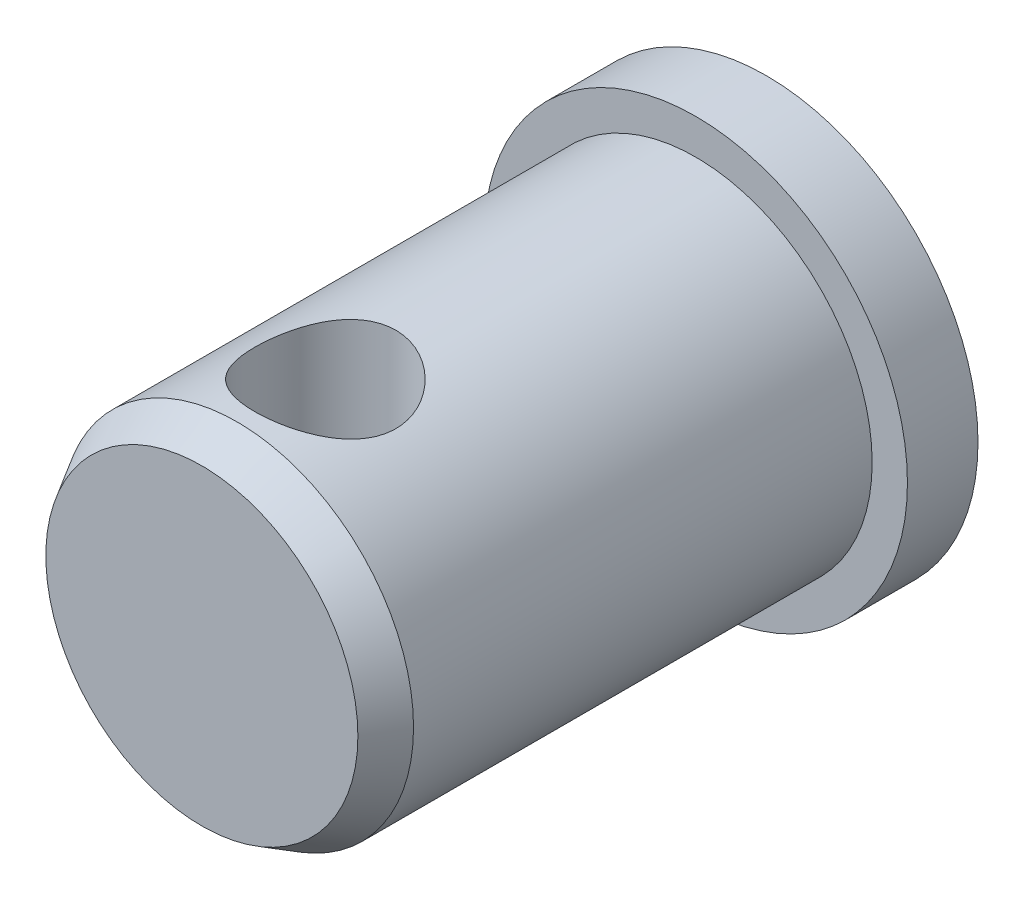
ISO-10303-21;
HEADER;
FILE_DESCRIPTION(('STEP AP214'),'2;1');
FILE_NAME('part.step','',(''),(''),'','','');
FILE_SCHEMA(('AUTOMOTIVE_DESIGN { 1 0 10303 214 1 1 1 1 }'));
ENDSEC;
DATA;
#1=APPLICATION_CONTEXT('core data for automotive mechanical design processes');
#2=APPLICATION_PROTOCOL_DEFINITION('international standard','automotive_design',2000,#1);
#3=PRODUCT_CONTEXT('',#1,'mechanical');
#4=PRODUCT('Part','Part','',(#3));
#5=PRODUCT_RELATED_PRODUCT_CATEGORY('part','',(#4));
#6=PRODUCT_DEFINITION_FORMATION('','',#4);
#7=PRODUCT_DEFINITION_CONTEXT('part definition',#1,'design');
#8=PRODUCT_DEFINITION('design','',#6,#7);
#9=PRODUCT_DEFINITION_SHAPE('','',#8);
#10=(LENGTH_UNIT() NAMED_UNIT(*) SI_UNIT(.MILLI.,.METRE.));
#11=(NAMED_UNIT(*) PLANE_ANGLE_UNIT() SI_UNIT($,.RADIAN.));
#12=(NAMED_UNIT(*) SI_UNIT($,.STERADIAN.) SOLID_ANGLE_UNIT());
#13=UNCERTAINTY_MEASURE_WITH_UNIT(LENGTH_MEASURE(1.E-05),#10,'distance_accuracy_value','');
#14=(GEOMETRIC_REPRESENTATION_CONTEXT(3) GLOBAL_UNCERTAINTY_ASSIGNED_CONTEXT((#13)) GLOBAL_UNIT_ASSIGNED_CONTEXT((#10,
#11,#12)) REPRESENTATION_CONTEXT('',''));
#15=CARTESIAN_POINT('',(0.,0.,0.));
#16=DIRECTION('',(0.,0.,1.));
#17=DIRECTION('',(1.,0.,0.));
#18=AXIS2_PLACEMENT_3D('',#15,#16,#17);
#19=CARTESIAN_POINT('',(0.,0.,1.));
#20=DIRECTION('',(0.,0.,-1.));
#21=DIRECTION('',(-1.,0.,0.));
#22=AXIS2_PLACEMENT_3D('',#19,#20,#21);
#23=CYLINDRICAL_SURFACE('',#22,3.);
#24=CARTESIAN_POINT('',(0.,0.,1.));
#25=DIRECTION('',(0.,0.,1.));
#26=DIRECTION('',(1.,0.,0.));
#27=AXIS2_PLACEMENT_3D('',#24,#25,#26);
#28=CIRCLE('',#27,3.);
#29=CARTESIAN_POINT('',(3.,0.,1.));
#30=VERTEX_POINT('',#29);
#31=EDGE_CURVE('E50',#30,#30,#28,.T.);
#32=ORIENTED_EDGE('',*,*,#31,.F.);
#33=EDGE_LOOP('',(#32));
#34=FACE_BOUND('',#33,.T.);
#35=CARTESIAN_POINT('',(0.,0.,0.));
#36=DIRECTION('',(0.,0.,1.));
#37=DIRECTION('',(1.,0.,0.));
#38=AXIS2_PLACEMENT_3D('',#35,#36,#37);
#39=CIRCLE('',#38,3.);
#40=CARTESIAN_POINT('',(3.,0.,0.));
#41=VERTEX_POINT('',#40);
#42=EDGE_CURVE('E92',#41,#41,#39,.T.);
#43=ORIENTED_EDGE('',*,*,#42,.T.);
#44=EDGE_LOOP('',(#43));
#45=FACE_BOUND('',#44,.T.);
#46=ADVANCED_FACE('F33',(#34,#45),#23,.T.);
#47=CARTESIAN_POINT('',(0.,0.,1.));
#48=DIRECTION('',(0.,0.,1.));
#49=DIRECTION('',(1.,0.,0.));
#50=AXIS2_PLACEMENT_3D('',#47,#48,#49);
#51=PLANE('',#50);
#52=CARTESIAN_POINT('',(0.,0.,1.));
#53=DIRECTION('',(0.,0.,1.));
#54=DIRECTION('',(1.,0.,0.));
#55=AXIS2_PLACEMENT_3D('',#52,#53,#54);
#56=CIRCLE('',#55,2.5);
#57=CARTESIAN_POINT('',(2.5,0.,1.));
#58=VERTEX_POINT('',#57);
#59=EDGE_CURVE('E93',#58,#58,#56,.F.);
#60=ORIENTED_EDGE('',*,*,#59,.T.);
#61=EDGE_LOOP('',(#60));
#62=FACE_BOUND('',#61,.T.);
#63=ORIENTED_EDGE('',*,*,#31,.T.);
#64=EDGE_LOOP('',(#63));
#65=FACE_BOUND('',#64,.T.);
#66=ADVANCED_FACE('F77',(#62,#65),#51,.T.);
#67=CARTESIAN_POINT('',(0.,0.,0.));
#68=DIRECTION('',(0.,0.,1.));
#69=DIRECTION('',(1.,0.,0.));
#70=AXIS2_PLACEMENT_3D('',#67,#68,#69);
#71=PLANE('',#70);
#72=ORIENTED_EDGE('',*,*,#42,.F.);
#73=EDGE_LOOP('',(#72));
#74=FACE_BOUND('',#73,.T.);
#75=ADVANCED_FACE('F74',(#74),#71,.F.);
#76=CARTESIAN_POINT('',(0.,0.,8.));
#77=DIRECTION('',(0.,0.,-1.));
#78=DIRECTION('',(-1.,0.,0.));
#79=AXIS2_PLACEMENT_3D('',#76,#77,#78);
#80=CYLINDRICAL_SURFACE('',#79,2.5);
#81=CARTESIAN_POINT('',(0.,-2.5,7.25));
#82=CARTESIAN_POINT('',(0.0537465027214457,-2.49999635613542,7.24999507408814));
#83=CARTESIAN_POINT('',(0.107586282045337,-2.49824647153466,7.24564112395581));
#84=CARTESIAN_POINT('',(0.213748240208948,-2.49141726550321,7.22837614823938));
#85=CARTESIAN_POINT('',(0.266065888780624,-2.48632889349439,7.21544186045693));
#86=CARTESIAN_POINT('',(0.367476961363701,-2.47337104606559,7.18156196097058));
#87=CARTESIAN_POINT('',(0.416580330808479,-2.46551068182036,7.16064257689164));
#88=CARTESIAN_POINT('',(0.510535985164183,-2.44778305398039,7.11149041333673));
#89=CARTESIAN_POINT('',(0.555389738375496,-2.43791648729028,7.08326017254053));
#90=CARTESIAN_POINT('',(0.641750503785196,-2.41665443085209,7.01888225071953));
#91=CARTESIAN_POINT('',(0.683031136275106,-2.40521148464595,6.98244667187987));
#92=CARTESIAN_POINT('',(0.759087502392361,-2.38230288453097,6.90329999826161));
#93=CARTESIAN_POINT('',(0.793860053566766,-2.37083722226896,6.86058585139413));
#94=CARTESIAN_POINT('',(0.857437283646439,-2.34861395898568,6.76778596487887));
#95=CARTESIAN_POINT('',(0.885907490597736,-2.33791057982476,6.7174567569884));
#96=CARTESIAN_POINT('',(0.933877359518574,-2.31916823593396,6.61223180078998));
#97=CARTESIAN_POINT('',(0.953381282142917,-2.31112800622088,6.55733823607582));
#98=CARTESIAN_POINT('',(0.981949411697933,-2.29913178830409,6.44714383320395));
#99=CARTESIAN_POINT('',(0.991446982902824,-2.29500710177803,6.39197438221189));
#100=CARTESIAN_POINT('',(1.00108648082001,-2.29082002024572,6.28068250084637));
#101=CARTESIAN_POINT('',(1.00123300815661,-2.29075562761384,6.22456055268749));
#102=CARTESIAN_POINT('',(0.992494683752272,-2.29455250139997,6.11712166427098));
#103=CARTESIAN_POINT('',(0.984237657152568,-2.29814087519225,6.06574214279549));
#104=CARTESIAN_POINT('',(0.95997344014891,-2.30838093803918,5.96517022199664));
#105=CARTESIAN_POINT('',(0.943964897402316,-2.31503316160836,5.91597820594485));
#106=CARTESIAN_POINT('',(0.904347366275536,-2.33079742544265,5.81999108190198));
#107=CARTESIAN_POINT('',(0.880589931157658,-2.33995689640394,5.77326538047266));
#108=CARTESIAN_POINT('',(0.826253230366107,-2.35969058194945,5.68429209181922));
#109=CARTESIAN_POINT('',(0.795671402550421,-2.37026532728424,5.6420461952986));
#110=CARTESIAN_POINT('',(0.725775299727216,-2.39263368371135,5.559795135599));
#111=CARTESIAN_POINT('',(0.685968731485317,-2.40445832488076,5.52021563527699));
#112=CARTESIAN_POINT('',(0.600157213715096,-2.42729912479141,5.44815776099898));
#113=CARTESIAN_POINT('',(0.554151032667217,-2.43831512222662,5.41568080129485));
#114=CARTESIAN_POINT('',(0.456038826302922,-2.45857340632274,5.35819127629208));
#115=CARTESIAN_POINT('',(0.403830245673239,-2.46777635047707,5.33333885940147));
#116=CARTESIAN_POINT('',(0.295511882741441,-2.48307414164379,5.29291606946097));
#117=CARTESIAN_POINT('',(0.239404098424838,-2.48917056731191,5.2773409812213));
#118=CARTESIAN_POINT('',(0.128447943803911,-2.49728069753455,5.25677585229015));
#119=CARTESIAN_POINT('',(0.0737216469927678,-2.49951472916757,5.25121377287322));
#120=CARTESIAN_POINT('',(-0.0359226549039082,-2.50034239255315,5.24914344973569));
#121=CARTESIAN_POINT('',(-0.0908406066119614,-2.49893696791146,5.25263285922625));
#122=CARTESIAN_POINT('',(-0.196716369560993,-2.49278783531877,5.268145876276));
#123=CARTESIAN_POINT('',(-0.247741245887737,-2.48819695672762,5.27977899017549));
#124=CARTESIAN_POINT('',(-0.34706771403039,-2.4762972070275,5.31071785415491));
#125=CARTESIAN_POINT('',(-0.395368955112422,-2.46898798678265,5.33002458983434));
#126=CARTESIAN_POINT('',(-0.489539392908351,-2.45208297385406,5.37639246983997));
#127=CARTESIAN_POINT('',(-0.535289011377703,-2.44242407989902,5.40367273602157));
#128=CARTESIAN_POINT('',(-0.621721795623277,-2.42186682372762,5.46497016195282));
#129=CARTESIAN_POINT('',(-0.662402920380562,-2.41096796555135,5.49899002146131));
#130=CARTESIAN_POINT('',(-0.740361521514409,-2.38822558819056,5.57543500647481));
#131=CARTESIAN_POINT('',(-0.777236966903032,-2.37636720712526,5.6182667707531));
#132=CARTESIAN_POINT('',(-0.843375598706855,-2.35370836458566,5.70972004150468));
#133=CARTESIAN_POINT('',(-0.872637530668754,-2.34290807763255,5.75834250016997));
#134=CARTESIAN_POINT('',(-0.922903750965813,-2.32357149953854,5.86073084729705));
#135=CARTESIAN_POINT('',(-0.943825297267226,-2.31505815442394,5.91454199960615));
#136=CARTESIAN_POINT('',(-0.976148109852652,-2.30161836738966,6.02536682585758));
#137=CARTESIAN_POINT('',(-0.987556402634657,-2.29668927847999,6.08237810290621));
#138=CARTESIAN_POINT('',(-0.999857808639201,-2.29135879649963,6.19356395088727));
#139=CARTESIAN_POINT('',(-1.00144854115143,-2.29065710504086,6.24764741979667));
#140=CARTESIAN_POINT('',(-0.995901579638762,-2.29307418016549,6.35527242885665));
#141=CARTESIAN_POINT('',(-0.988764993956891,-2.29619246162397,6.40881403695129));
#142=CARTESIAN_POINT('',(-0.966535683076824,-2.3056332453951,6.51166609492752));
#143=CARTESIAN_POINT('',(-0.951768746785489,-2.31182415913725,6.5610601372165));
#144=CARTESIAN_POINT('',(-0.915002724245507,-2.32662000616348,6.65668931480674));
#145=CARTESIAN_POINT('',(-0.893001640696907,-2.33522560603003,6.70292357344991));
#146=CARTESIAN_POINT('',(-0.840936381379866,-2.35449304802246,6.79380480963539));
#147=CARTESIAN_POINT('',(-0.810482667579745,-2.36524441156621,6.83820933506524));
#148=CARTESIAN_POINT('',(-0.742946059635748,-2.38731902186119,6.92149665860188));
#149=CARTESIAN_POINT('',(-0.705861167409061,-2.39864244024203,6.96037778606416));
#150=CARTESIAN_POINT('',(-0.623252753136232,-2.42146783543697,7.03410142663181));
#151=CARTESIAN_POINT('',(-0.57733800057307,-2.43293378981093,7.06851865344903));
#152=CARTESIAN_POINT('',(-0.47995016014289,-2.45400203356858,7.12916852131082));
#153=CARTESIAN_POINT('',(-0.428474502273619,-2.46360345546453,7.15539735607626));
#154=CARTESIAN_POINT('',(-0.322369031247602,-2.47969857407931,7.19831110759515));
#155=CARTESIAN_POINT('',(-0.267815809109848,-2.48624681527514,7.21516466178017));
#156=CARTESIAN_POINT('',(-0.156438273140611,-2.49572153104683,7.23931956047713));
#157=CARTESIAN_POINT('',(-0.0996217629294568,-2.49865949747819,7.24665121837195));
#158=CARTESIAN_POINT('',(-0.0284561489454652,-2.49987949752068,7.24969769048914));
#159=CARTESIAN_POINT('',(-0.0142313443703794,-2.50000096484588,7.2500013043146));
#160=CARTESIAN_POINT('',(0.,-2.5,7.25));
#161=B_SPLINE_CURVE_WITH_KNOTS('',3,(#81,#82,#83,#84,#85,#86,#87,#88,#89,#90,#91,#92,#93,#94,
#95,#96,#97,#98,#99,#100,#101,#102,#103,#104,#105,#106,#107,#108,#109,#110,#111,#112,#113,#114,
#115,#116,#117,#118,#119,#120,#121,#122,#123,#124,#125,#126,#127,#128,#129,#130,#131,#132,#133,
#134,#135,#136,#137,#138,#139,#140,#141,#142,#143,#144,#145,#146,#147,#148,#149,#150,#151,#152,
#153,#154,#155,#156,#157,#158,#159,#160),.UNSPECIFIED.,.T.,.F.,(4,2,2,2,2,2,2,2,2,2,2,2,2,2,2,2,
2,2,2,2,2,2,2,2,2,2,2,2,2,2,2,2,2,2,2,2,2,2,2,4),(0.,0.161201493946536,0.322841818003967,
0.48395572873579,0.645013767839921,0.812986908501985,0.981041974672057,1.15657629409608,
1.33202711559134,1.49952052654414,1.66693153170244,1.82269164200686,1.97847893628024,
2.13744563149408,2.29647210969092,2.46779174593278,2.63914546419866,2.81388456581403,
2.98853478056895,3.15284592264004,3.31711446785041,3.47400227782183,3.63091024496898,
3.79261756699131,3.95438979749484,4.12684237312207,4.29932334521874,4.47347522570414,
4.64749836322967,4.80899836696374,4.97047786281523,5.12557159274384,5.28070817902581,
5.44472734028346,5.60879600674197,5.78350211766918,5.95828931820266,6.12982150506659,
6.30080626202171,6.34349022948398),.UNSPECIFIED.);
#162=CARTESIAN_POINT('',(0.,-2.5,7.25));
#163=VERTEX_POINT('',#162);
#164=EDGE_CURVE('E37',#163,#163,#161,.T.);
#165=ORIENTED_EDGE('',*,*,#164,.T.);
#166=EDGE_LOOP('',(#165));
#167=FACE_BOUND('',#166,.T.);
#168=CARTESIAN_POINT('',(0.,2.5,7.25));
#169=CARTESIAN_POINT('',(-0.0537465027214457,2.49999635613542,7.24999507408814));
#170=CARTESIAN_POINT('',(-0.107586282045337,2.49824647153466,7.24564112395581));
#171=CARTESIAN_POINT('',(-0.213748240208948,2.49141726550321,7.22837614823938));
#172=CARTESIAN_POINT('',(-0.266065888780624,2.48632889349439,7.21544186045693));
#173=CARTESIAN_POINT('',(-0.367476961363701,2.47337104606559,7.18156196097058));
#174=CARTESIAN_POINT('',(-0.416580330808479,2.46551068182036,7.16064257689164));
#175=CARTESIAN_POINT('',(-0.510535985164183,2.44778305398039,7.11149041333673));
#176=CARTESIAN_POINT('',(-0.555389738375496,2.43791648729028,7.08326017254053));
#177=CARTESIAN_POINT('',(-0.641750503785197,2.41665443085209,7.01888225071953));
#178=CARTESIAN_POINT('',(-0.683031136275107,2.40521148464595,6.98244667187987));
#179=CARTESIAN_POINT('',(-0.759087502392361,2.38230288453097,6.90329999826161));
#180=CARTESIAN_POINT('',(-0.793860053566766,2.37083722226896,6.86058585139413));
#181=CARTESIAN_POINT('',(-0.85743728364644,2.34861395898568,6.76778596487887));
#182=CARTESIAN_POINT('',(-0.885907490597737,2.33791057982476,6.7174567569884));
#183=CARTESIAN_POINT('',(-0.933877359518574,2.31916823593396,6.61223180078998));
#184=CARTESIAN_POINT('',(-0.953381282142917,2.31112800622088,6.55733823607582));
#185=CARTESIAN_POINT('',(-0.981949411697934,2.29913178830409,6.44714383320395));
#186=CARTESIAN_POINT('',(-0.991446982902824,2.29500710177803,6.39197438221189));
#187=CARTESIAN_POINT('',(-1.00108648082001,2.29082002024572,6.28068250084637));
#188=CARTESIAN_POINT('',(-1.00123300815661,2.29075562761384,6.22456055268749));
#189=CARTESIAN_POINT('',(-0.992494683752272,2.29455250139997,6.11712166427098));
#190=CARTESIAN_POINT('',(-0.984237657152568,2.29814087519225,6.06574214279549));
#191=CARTESIAN_POINT('',(-0.95997344014891,2.30838093803918,5.96517022199664));
#192=CARTESIAN_POINT('',(-0.943964897402316,2.31503316160836,5.91597820594485));
#193=CARTESIAN_POINT('',(-0.904347366275537,2.33079742544265,5.81999108190198));
#194=CARTESIAN_POINT('',(-0.880589931157659,2.33995689640394,5.77326538047266));
#195=CARTESIAN_POINT('',(-0.826253230366107,2.35969058194945,5.68429209181922));
#196=CARTESIAN_POINT('',(-0.795671402550422,2.37026532728424,5.6420461952986));
#197=CARTESIAN_POINT('',(-0.725775299727217,2.39263368371135,5.559795135599));
#198=CARTESIAN_POINT('',(-0.685968731485318,2.40445832488076,5.52021563527699));
#199=CARTESIAN_POINT('',(-0.600157213715097,2.42729912479141,5.44815776099898));
#200=CARTESIAN_POINT('',(-0.554151032667217,2.43831512222662,5.41568080129485));
#201=CARTESIAN_POINT('',(-0.456038826302922,2.45857340632274,5.35819127629208));
#202=CARTESIAN_POINT('',(-0.403830245673239,2.46777635047707,5.33333885940147));
#203=CARTESIAN_POINT('',(-0.295511882741442,2.48307414164379,5.29291606946097));
#204=CARTESIAN_POINT('',(-0.239404098424838,2.48917056731191,5.2773409812213));
#205=CARTESIAN_POINT('',(-0.128447943803911,2.49728069753455,5.25677585229015));
#206=CARTESIAN_POINT('',(-0.073721646992768,2.49951472916757,5.25121377287322));
#207=CARTESIAN_POINT('',(0.0359226549039079,2.50034239255315,5.24914344973569));
#208=CARTESIAN_POINT('',(0.0908406066119613,2.49893696791146,5.25263285922625));
#209=CARTESIAN_POINT('',(0.196716369560994,2.49278783531877,5.268145876276));
#210=CARTESIAN_POINT('',(0.247741245887737,2.48819695672762,5.27977899017549));
#211=CARTESIAN_POINT('',(0.34706771403039,2.4762972070275,5.31071785415491));
#212=CARTESIAN_POINT('',(0.395368955112422,2.46898798678265,5.33002458983434));
#213=CARTESIAN_POINT('',(0.489539392908351,2.45208297385406,5.37639246983997));
#214=CARTESIAN_POINT('',(0.535289011377703,2.44242407989902,5.40367273602157));
#215=CARTESIAN_POINT('',(0.621721795623278,2.42186682372762,5.46497016195282));
#216=CARTESIAN_POINT('',(0.662402920380563,2.41096796555135,5.49899002146131));
#217=CARTESIAN_POINT('',(0.740361521514409,2.38822558819056,5.57543500647481));
#218=CARTESIAN_POINT('',(0.777236966903032,2.37636720712526,5.6182667707531));
#219=CARTESIAN_POINT('',(0.843375598706855,2.35370836458566,5.70972004150468));
#220=CARTESIAN_POINT('',(0.872637530668754,2.34290807763255,5.75834250016997));
#221=CARTESIAN_POINT('',(0.922903750965814,2.32357149953854,5.86073084729705));
#222=CARTESIAN_POINT('',(0.943825297267226,2.31505815442394,5.91454199960616));
#223=CARTESIAN_POINT('',(0.976148109852652,2.30161836738966,6.02536682585758));
#224=CARTESIAN_POINT('',(0.987556402634657,2.29668927847999,6.08237810290621));
#225=CARTESIAN_POINT('',(0.999857808639201,2.29135879649963,6.19356395088727));
#226=CARTESIAN_POINT('',(1.00144854115143,2.29065710504086,6.24764741979668));
#227=CARTESIAN_POINT('',(0.995901579638762,2.29307418016549,6.35527242885665));
#228=CARTESIAN_POINT('',(0.988764993956891,2.29619246162397,6.40881403695129));
#229=CARTESIAN_POINT('',(0.966535683076824,2.3056332453951,6.51166609492752));
#230=CARTESIAN_POINT('',(0.951768746785489,2.31182415913725,6.5610601372165));
#231=CARTESIAN_POINT('',(0.915002724245507,2.32662000616348,6.65668931480674));
#232=CARTESIAN_POINT('',(0.893001640696907,2.33522560603003,6.70292357344991));
#233=CARTESIAN_POINT('',(0.840936381379866,2.35449304802246,6.79380480963539));
#234=CARTESIAN_POINT('',(0.810482667579745,2.36524441156621,6.83820933506524));
#235=CARTESIAN_POINT('',(0.742946059635749,2.38731902186119,6.92149665860188));
#236=CARTESIAN_POINT('',(0.705861167409062,2.39864244024203,6.96037778606416));
#237=CARTESIAN_POINT('',(0.623252753136232,2.42146783543697,7.03410142663181));
#238=CARTESIAN_POINT('',(0.57733800057307,2.43293378981093,7.06851865344903));
#239=CARTESIAN_POINT('',(0.479950160142891,2.45400203356858,7.12916852131082));
#240=CARTESIAN_POINT('',(0.42847450227362,2.46360345546453,7.15539735607626));
#241=CARTESIAN_POINT('',(0.322369031247602,2.47969857407931,7.19831110759515));
#242=CARTESIAN_POINT('',(0.267815809109849,2.48624681527514,7.21516466178017));
#243=CARTESIAN_POINT('',(0.156438273140611,2.49572153104683,7.23931956047713));
#244=CARTESIAN_POINT('',(0.099621762929457,2.49865949747819,7.24665121837195));
#245=CARTESIAN_POINT('',(0.0284561489454652,2.49987949752068,7.24969769048914));
#246=CARTESIAN_POINT('',(0.0142313443703794,2.50000096484588,7.2500013043146));
#247=CARTESIAN_POINT('',(0.,2.5,7.25));
#248=B_SPLINE_CURVE_WITH_KNOTS('',3,(#168,#169,#170,#171,#172,#173,#174,#175,#176,#177,#178,
#179,#180,#181,#182,#183,#184,#185,#186,#187,#188,#189,#190,#191,#192,#193,#194,#195,#196,#197,
#198,#199,#200,#201,#202,#203,#204,#205,#206,#207,#208,#209,#210,#211,#212,#213,#214,#215,#216,
#217,#218,#219,#220,#221,#222,#223,#224,#225,#226,#227,#228,#229,#230,#231,#232,#233,#234,#235,
#236,#237,#238,#239,#240,#241,#242,#243,#244,#245,#246,#247),.UNSPECIFIED.,.T.,.F.,(4,2,2,2,2,2,
2,2,2,2,2,2,2,2,2,2,2,2,2,2,2,2,2,2,2,2,2,2,2,2,2,2,2,2,2,2,2,2,2,4),(0.,0.161201493946536,
0.322841818003967,0.48395572873579,0.645013767839921,0.812986908501986,0.981041974672058,
1.15657629409608,1.33202711559134,1.49952052654414,1.66693153170244,1.82269164200686,
1.97847893628024,2.13744563149408,2.29647210969091,2.46779174593278,2.63914546419866,
2.81388456581403,2.98853478056895,3.15284592264004,3.31711446785041,3.47400227782183,
3.63091024496898,3.79261756699131,3.95438979749484,4.12684237312207,4.29932334521874,
4.47347522570414,4.64749836322967,4.80899836696374,4.97047786281523,5.12557159274384,
5.28070817902581,5.44472734028346,5.60879600674196,5.78350211766918,5.95828931820266,
6.12982150506659,6.30080626202171,6.34349022948398),.UNSPECIFIED.);
#249=CARTESIAN_POINT('',(0.,2.5,7.25));
#250=VERTEX_POINT('',#249);
#251=EDGE_CURVE('E53',#250,#250,#248,.T.);
#252=ORIENTED_EDGE('',*,*,#251,.T.);
#253=EDGE_LOOP('',(#252));
#254=FACE_BOUND('',#253,.T.);
#255=CARTESIAN_POINT('',(0.,0.,7.49999999999999));
#256=DIRECTION('',(0.,0.,1.));
#257=DIRECTION('',(1.,0.,0.));
#258=AXIS2_PLACEMENT_3D('',#255,#256,#257);
#259=CIRCLE('',#258,2.5);
#260=CARTESIAN_POINT('',(2.5,0.,7.49999999999999));
#261=VERTEX_POINT('',#260);
#262=EDGE_CURVE('E10',#261,#261,#259,.F.);
#263=ORIENTED_EDGE('',*,*,#262,.T.);
#264=EDGE_LOOP('',(#263));
#265=FACE_BOUND('',#264,.T.);
#266=ORIENTED_EDGE('',*,*,#59,.F.);
#267=EDGE_LOOP('',(#266));
#268=FACE_BOUND('',#267,.T.);
#269=ADVANCED_FACE('F57',(#167,#254,#265,#268),#80,.T.);
#270=CARTESIAN_POINT('',(0.,0.,8.));
#271=DIRECTION('',(0.,0.,1.));
#272=DIRECTION('',(1.,0.,0.));
#273=AXIS2_PLACEMENT_3D('',#270,#271,#272);
#274=PLANE('',#273);
#275=CARTESIAN_POINT('',(0.,0.,8.));
#276=DIRECTION('',(0.,0.,1.));
#277=DIRECTION('',(1.,0.,0.));
#278=AXIS2_PLACEMENT_3D('',#275,#276,#277);
#279=CIRCLE('',#278,2.21132486540519);
#280=CARTESIAN_POINT('',(2.21132486540519,0.,8.));
#281=VERTEX_POINT('',#280);
#282=EDGE_CURVE('E45',#281,#281,#279,.T.);
#283=ORIENTED_EDGE('',*,*,#282,.T.);
#284=EDGE_LOOP('',(#283));
#285=FACE_BOUND('',#284,.T.);
#286=ADVANCED_FACE('F65',(#285),#274,.T.);
#287=CARTESIAN_POINT('',(0.,0.,8.));
#288=DIRECTION('',(0.,0.,-1.));
#289=DIRECTION('',(-1.,0.,0.));
#290=AXIS2_PLACEMENT_3D('',#287,#288,#289);
#291=CONICAL_SURFACE('',#290,2.21132486540519,0.523598775598296);
#292=ORIENTED_EDGE('',*,*,#262,.F.);
#293=EDGE_LOOP('',(#292));
#294=FACE_BOUND('',#293,.T.);
#295=ORIENTED_EDGE('',*,*,#282,.F.);
#296=EDGE_LOOP('',(#295));
#297=FACE_BOUND('',#296,.T.);
#298=ADVANCED_FACE('F35',(#294,#297),#291,.T.);
#299=CARTESIAN_POINT('',(0.,-3.,6.25));
#300=DIRECTION('',(0.,1.,0.));
#301=DIRECTION('',(0.,0.,1.));
#302=AXIS2_PLACEMENT_3D('',#299,#300,#301);
#303=CYLINDRICAL_SURFACE('',#302,1.);
#304=ORIENTED_EDGE('',*,*,#251,.F.);
#305=EDGE_LOOP('',(#304));
#306=FACE_BOUND('',#305,.T.);
#307=ORIENTED_EDGE('',*,*,#164,.F.);
#308=EDGE_LOOP('',(#307));
#309=FACE_BOUND('',#308,.T.);
#310=ADVANCED_FACE('F61',(#306,#309),#303,.F.);
#311=CLOSED_SHELL('',(#46,#66,#75,#269,#286,#298,#310));
#312=MANIFOLD_SOLID_BREP('B2',#311);
#313=ADVANCED_BREP_SHAPE_REPRESENTATION('',(#18,#312),#14);
#314=SHAPE_DEFINITION_REPRESENTATION(#9,#313);
ENDSEC;
END-ISO-10303-21;
